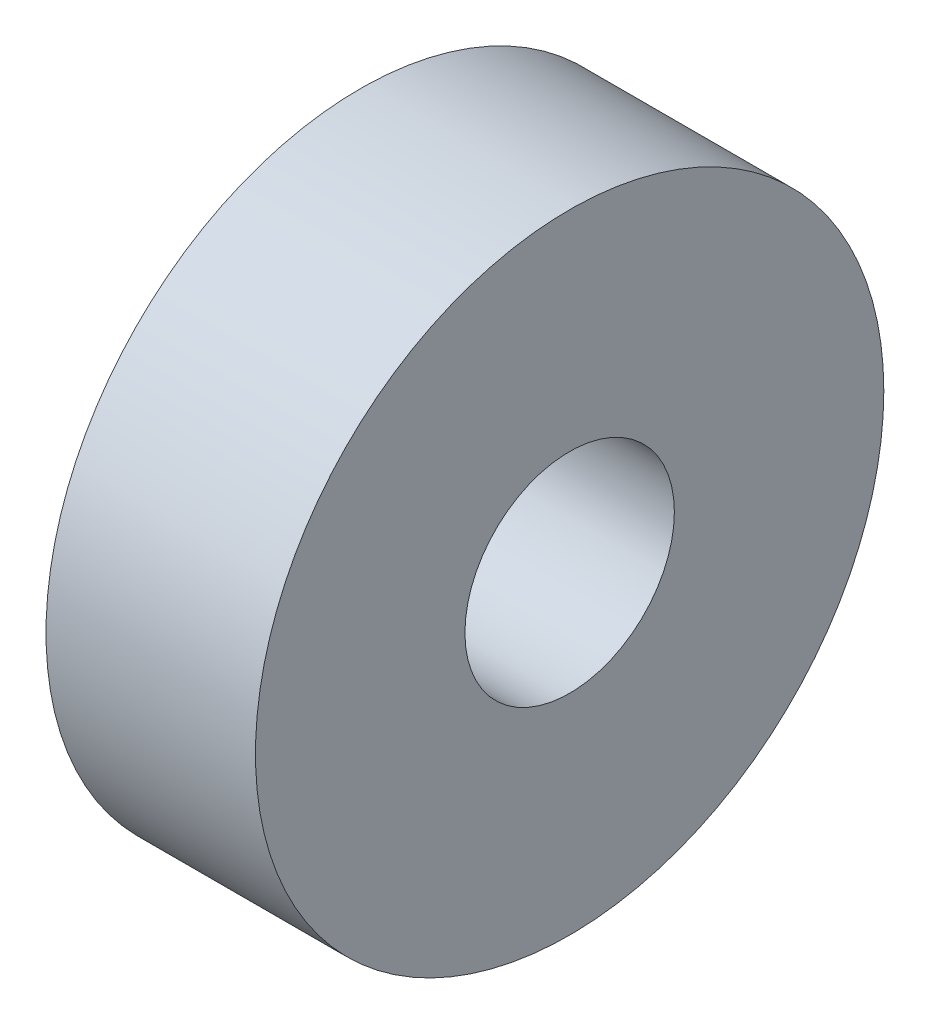
ISO-10303-21;
HEADER;
FILE_DESCRIPTION(('STEP AP214'),'2;1');
FILE_NAME('part.step','',(''),(''),'','','');
FILE_SCHEMA(('AUTOMOTIVE_DESIGN { 1 0 10303 214 1 1 1 1 }'));
ENDSEC;
DATA;
#1=APPLICATION_CONTEXT('core data for automotive mechanical design processes');
#2=APPLICATION_PROTOCOL_DEFINITION('international standard','automotive_design',2000,#1);
#3=PRODUCT_CONTEXT('',#1,'mechanical');
#4=PRODUCT('Part','Part','',(#3));
#5=PRODUCT_RELATED_PRODUCT_CATEGORY('part','',(#4));
#6=PRODUCT_DEFINITION_FORMATION('','',#4);
#7=PRODUCT_DEFINITION_CONTEXT('part definition',#1,'design');
#8=PRODUCT_DEFINITION('design','',#6,#7);
#9=PRODUCT_DEFINITION_SHAPE('','',#8);
#10=(LENGTH_UNIT() NAMED_UNIT(*) SI_UNIT(.MILLI.,.METRE.));
#11=(NAMED_UNIT(*) PLANE_ANGLE_UNIT() SI_UNIT($,.RADIAN.));
#12=(NAMED_UNIT(*) SI_UNIT($,.STERADIAN.) SOLID_ANGLE_UNIT());
#13=UNCERTAINTY_MEASURE_WITH_UNIT(LENGTH_MEASURE(1.E-05),#10,'distance_accuracy_value','');
#14=(GEOMETRIC_REPRESENTATION_CONTEXT(3) GLOBAL_UNCERTAINTY_ASSIGNED_CONTEXT((#13)) GLOBAL_UNIT_ASSIGNED_CONTEXT((#10,
#11,#12)) REPRESENTATION_CONTEXT('',''));
#15=CARTESIAN_POINT('',(0.,0.,0.));
#16=DIRECTION('',(0.,0.,1.));
#17=DIRECTION('',(1.,0.,0.));
#18=AXIS2_PLACEMENT_3D('',#15,#16,#17);
#19=CARTESIAN_POINT('',(4.,0.,0.));
#20=DIRECTION('',(1.,0.,0.));
#21=DIRECTION('',(0.,0.,-1.));
#22=AXIS2_PLACEMENT_3D('',#19,#20,#21);
#23=PLANE('',#22);
#24=CARTESIAN_POINT('',(4.,0.,0.));
#25=DIRECTION('',(1.,0.,0.));
#26=DIRECTION('',(0.,0.,-1.));
#27=AXIS2_PLACEMENT_3D('',#24,#25,#26);
#28=CIRCLE('',#27,6.);
#29=CARTESIAN_POINT('',(4.,0.,-6.));
#30=VERTEX_POINT('',#29);
#31=EDGE_CURVE('E10',#30,#30,#28,.T.);
#32=ORIENTED_EDGE('',*,*,#31,.T.);
#33=EDGE_LOOP('',(#32));
#34=FACE_BOUND('',#33,.T.);
#35=CARTESIAN_POINT('',(4.,0.,0.));
#36=DIRECTION('',(1.,0.,0.));
#37=DIRECTION('',(0.,0.,-1.));
#38=AXIS2_PLACEMENT_3D('',#35,#36,#37);
#39=CIRCLE('',#38,2.);
#40=CARTESIAN_POINT('',(4.,0.,-2.));
#41=VERTEX_POINT('',#40);
#42=EDGE_CURVE('E45',#41,#41,#39,.T.);
#43=ORIENTED_EDGE('',*,*,#42,.F.);
#44=EDGE_LOOP('',(#43));
#45=FACE_BOUND('',#44,.T.);
#46=ADVANCED_FACE('F34',(#34,#45),#23,.T.);
#47=CARTESIAN_POINT('',(0.,0.,0.));
#48=DIRECTION('',(1.,0.,0.));
#49=DIRECTION('',(0.,0.,-1.));
#50=AXIS2_PLACEMENT_3D('',#47,#48,#49);
#51=PLANE('',#50);
#52=CARTESIAN_POINT('',(0.,0.,0.));
#53=DIRECTION('',(1.,0.,0.));
#54=DIRECTION('',(0.,0.,-1.));
#55=AXIS2_PLACEMENT_3D('',#52,#53,#54);
#56=CIRCLE('',#55,6.);
#57=CARTESIAN_POINT('',(0.,0.,-6.));
#58=VERTEX_POINT('',#57);
#59=EDGE_CURVE('E38',#58,#58,#56,.T.);
#60=ORIENTED_EDGE('',*,*,#59,.F.);
#61=EDGE_LOOP('',(#60));
#62=FACE_BOUND('',#61,.T.);
#63=CARTESIAN_POINT('',(0.,0.,0.));
#64=DIRECTION('',(1.,0.,0.));
#65=DIRECTION('',(0.,0.,-1.));
#66=AXIS2_PLACEMENT_3D('',#63,#64,#65);
#67=CIRCLE('',#66,2.);
#68=CARTESIAN_POINT('',(0.,0.,-2.));
#69=VERTEX_POINT('',#68);
#70=EDGE_CURVE('E47',#69,#69,#67,.T.);
#71=ORIENTED_EDGE('',*,*,#70,.T.);
#72=EDGE_LOOP('',(#71));
#73=FACE_BOUND('',#72,.T.);
#74=ADVANCED_FACE('F57',(#62,#73),#51,.F.);
#75=CARTESIAN_POINT('',(4.,0.,0.));
#76=DIRECTION('',(-1.,0.,0.));
#77=DIRECTION('',(0.,0.,1.));
#78=AXIS2_PLACEMENT_3D('',#75,#76,#77);
#79=CYLINDRICAL_SURFACE('',#78,6.);
#80=ORIENTED_EDGE('',*,*,#31,.F.);
#81=EDGE_LOOP('',(#80));
#82=FACE_BOUND('',#81,.T.);
#83=ORIENTED_EDGE('',*,*,#59,.T.);
#84=EDGE_LOOP('',(#83));
#85=FACE_BOUND('',#84,.T.);
#86=ADVANCED_FACE('F36',(#82,#85),#79,.T.);
#87=CARTESIAN_POINT('',(4.,0.,0.));
#88=DIRECTION('',(-1.,0.,0.));
#89=DIRECTION('',(0.,0.,1.));
#90=AXIS2_PLACEMENT_3D('',#87,#88,#89);
#91=CYLINDRICAL_SURFACE('',#90,2.);
#92=ORIENTED_EDGE('',*,*,#42,.T.);
#93=EDGE_LOOP('',(#92));
#94=FACE_BOUND('',#93,.T.);
#95=ORIENTED_EDGE('',*,*,#70,.F.);
#96=EDGE_LOOP('',(#95));
#97=FACE_BOUND('',#96,.T.);
#98=ADVANCED_FACE('F53',(#94,#97),#91,.F.);
#99=CLOSED_SHELL('',(#46,#74,#86,#98));
#100=MANIFOLD_SOLID_BREP('B2',#99);
#101=ADVANCED_BREP_SHAPE_REPRESENTATION('',(#18,#100),#14);
#102=SHAPE_DEFINITION_REPRESENTATION(#9,#101);
ENDSEC;
END-ISO-10303-21;
